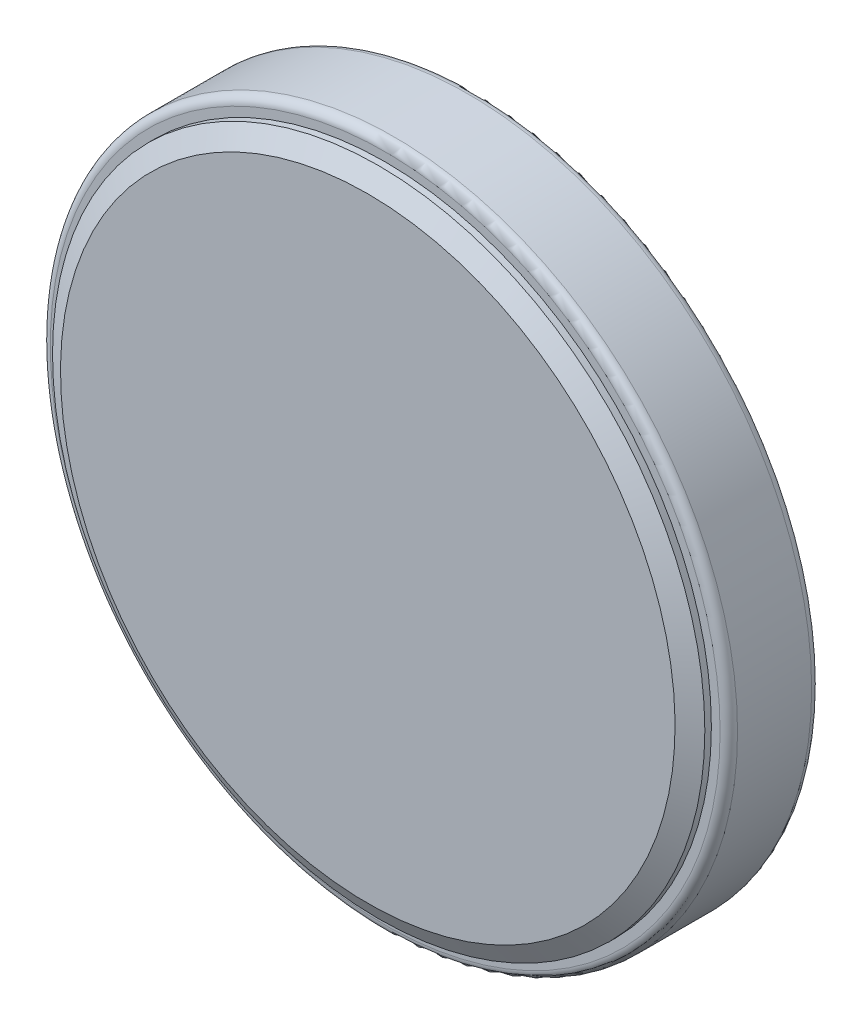
ISO-10303-21;
HEADER;
FILE_DESCRIPTION(('STEP AP214'),'2;1');
FILE_NAME('part.step','',(''),(''),'','','');
FILE_SCHEMA(('AUTOMOTIVE_DESIGN { 1 0 10303 214 1 1 1 1 }'));
ENDSEC;
DATA;
#1=APPLICATION_CONTEXT('core data for automotive mechanical design processes');
#2=APPLICATION_PROTOCOL_DEFINITION('international standard','automotive_design',2000,#1);
#3=PRODUCT_CONTEXT('',#1,'mechanical');
#4=PRODUCT('Part','Part','',(#3));
#5=PRODUCT_RELATED_PRODUCT_CATEGORY('part','',(#4));
#6=PRODUCT_DEFINITION_FORMATION('','',#4);
#7=PRODUCT_DEFINITION_CONTEXT('part definition',#1,'design');
#8=PRODUCT_DEFINITION('design','',#6,#7);
#9=PRODUCT_DEFINITION_SHAPE('','',#8);
#10=(LENGTH_UNIT() NAMED_UNIT(*) SI_UNIT(.MILLI.,.METRE.));
#11=(NAMED_UNIT(*) PLANE_ANGLE_UNIT() SI_UNIT($,.RADIAN.));
#12=(NAMED_UNIT(*) SI_UNIT($,.STERADIAN.) SOLID_ANGLE_UNIT());
#13=UNCERTAINTY_MEASURE_WITH_UNIT(LENGTH_MEASURE(1.E-05),#10,'distance_accuracy_value','');
#14=(GEOMETRIC_REPRESENTATION_CONTEXT(3) GLOBAL_UNCERTAINTY_ASSIGNED_CONTEXT((#13)) GLOBAL_UNIT_ASSIGNED_CONTEXT((#10,
#11,#12)) REPRESENTATION_CONTEXT('',''));
#15=CARTESIAN_POINT('',(0.,0.,0.));
#16=DIRECTION('',(0.,0.,1.));
#17=DIRECTION('',(1.,0.,0.));
#18=AXIS2_PLACEMENT_3D('',#15,#16,#17);
#19=CARTESIAN_POINT('',(0.,0.,0.508));
#20=DIRECTION('',(0.,0.,1.));
#21=DIRECTION('',(1.,0.,0.));
#22=AXIS2_PLACEMENT_3D('',#19,#20,#21);
#23=PLANE('',#22);
#24=CARTESIAN_POINT('',(0.,0.,0.508000019684426));
#25=DIRECTION('',(0.,0.,-1.));
#26=DIRECTION('',(0.,1.,0.));
#27=AXIS2_PLACEMENT_3D('',#24,#25,#26);
#28=CIRCLE('',#27,8.94967387996169);
#29=CARTESIAN_POINT('',(0.,8.94967387996169,0.508000019684426));
#30=VERTEX_POINT('',#29);
#31=EDGE_CURVE('E19',#30,#30,#28,.T.);
#32=ORIENTED_EDGE('',*,*,#31,.F.);
#33=EDGE_LOOP('',(#32));
#34=FACE_BOUND('',#33,.T.);
#35=ADVANCED_FACE('F16',(#34),#23,.T.);
#36=CARTESIAN_POINT('',(0.,0.,0.190500019026384));
#37=DIRECTION('',(0.,0.,-1.));
#38=DIRECTION('',(0.,1.,0.));
#39=AXIS2_PLACEMENT_3D('',#36,#37,#38);
#40=CONICAL_SURFACE('',#39,9.49960001098489,1.04719755);
#41=ORIENTED_EDGE('',*,*,#31,.T.);
#42=EDGE_LOOP('',(#41));
#43=FACE_BOUND('',#42,.T.);
#44=CARTESIAN_POINT('',(0.,0.,0.190500000000003));
#45=DIRECTION('',(0.,0.,-1.));
#46=DIRECTION('',(-1.,0.,0.));
#47=AXIS2_PLACEMENT_3D('',#44,#45,#46);
#48=CIRCLE('',#47,9.4996);
#49=CARTESIAN_POINT('',(-9.4996,0.,0.190500000000003));
#50=VERTEX_POINT('',#49);
#51=EDGE_CURVE('E177',#50,#50,#48,.T.);
#52=ORIENTED_EDGE('',*,*,#51,.F.);
#53=EDGE_LOOP('',(#52));
#54=FACE_BOUND('',#53,.T.);
#55=ADVANCED_FACE('F198',(#43,#54),#40,.T.);
#56=CARTESIAN_POINT('',(0.,0.,32.7109263142389));
#57=DIRECTION('',(0.,0.,-1.));
#58=DIRECTION('',(-1.,0.,0.));
#59=AXIS2_PLACEMENT_3D('',#56,#57,#58);
#60=CYLINDRICAL_SURFACE('',#59,9.4996);
#61=ORIENTED_EDGE('',*,*,#51,.T.);
#62=EDGE_LOOP('',(#61));
#63=FACE_BOUND('',#62,.T.);
#64=CARTESIAN_POINT('',(0.,0.,0.));
#65=DIRECTION('',(0.,0.,-1.));
#66=DIRECTION('',(-1.,0.,0.));
#67=AXIS2_PLACEMENT_3D('',#64,#65,#66);
#68=CIRCLE('',#67,9.4996);
#69=CARTESIAN_POINT('',(-9.4996,0.,0.));
#70=VERTEX_POINT('',#69);
#71=EDGE_CURVE('E185',#70,#70,#68,.T.);
#72=ORIENTED_EDGE('',*,*,#71,.F.);
#73=EDGE_LOOP('',(#72));
#74=FACE_BOUND('',#73,.T.);
#75=ADVANCED_FACE('F193',(#63,#74),#60,.T.);
#76=CARTESIAN_POINT('',(0.,0.,0.));
#77=DIRECTION('',(0.,0.,1.));
#78=DIRECTION('',(1.,0.,0.));
#79=AXIS2_PLACEMENT_3D('',#76,#77,#78);
#80=PLANE('',#79);
#81=ORIENTED_EDGE('',*,*,#71,.T.);
#82=EDGE_LOOP('',(#81));
#83=FACE_BOUND('',#82,.T.);
#84=CARTESIAN_POINT('',(0.,0.,0.));
#85=DIRECTION('',(0.,0.,-1.));
#86=DIRECTION('',(1.,0.,0.));
#87=AXIS2_PLACEMENT_3D('',#84,#85,#86);
#88=CIRCLE('',#87,9.7536);
#89=CARTESIAN_POINT('',(9.7536,0.,0.));
#90=VERTEX_POINT('',#89);
#91=EDGE_CURVE('E154',#90,#90,#88,.T.);
#92=ORIENTED_EDGE('',*,*,#91,.F.);
#93=EDGE_LOOP('',(#92));
#94=FACE_BOUND('',#93,.T.);
#95=ADVANCED_FACE('F167',(#83,#94),#80,.T.);
#96=CARTESIAN_POINT('',(0.,0.,-0.254));
#97=DIRECTION('',(0.,0.,1.));
#98=DIRECTION('',(1.,0.,0.));
#99=AXIS2_PLACEMENT_3D('',#96,#97,#98);
#100=TOROIDAL_SURFACE('',#99,9.7536,0.254);
#101=CARTESIAN_POINT('',(0.,0.,-0.254));
#102=DIRECTION('',(0.,0.,1.));
#103=DIRECTION('',(1.,0.,0.));
#104=AXIS2_PLACEMENT_3D('',#101,#102,#103);
#105=CIRCLE('',#104,10.0076);
#106=CARTESIAN_POINT('',(10.0076,0.,-0.254));
#107=VERTEX_POINT('',#106);
#108=EDGE_CURVE('E146',#107,#107,#105,.F.);
#109=ORIENTED_EDGE('',*,*,#108,.F.);
#110=EDGE_LOOP('',(#109));
#111=FACE_BOUND('',#110,.T.);
#112=ORIENTED_EDGE('',*,*,#91,.T.);
#113=EDGE_LOOP('',(#112));
#114=FACE_BOUND('',#113,.T.);
#115=ADVANCED_FACE('F162',(#111,#114),#100,.T.);
#116=CARTESIAN_POINT('',(0.,0.,-2.667));
#117=DIRECTION('',(0.,0.,1.));
#118=DIRECTION('',(1.,0.,0.));
#119=AXIS2_PLACEMENT_3D('',#116,#117,#118);
#120=CYLINDRICAL_SURFACE('',#119,10.0076);
#121=CARTESIAN_POINT('',(0.,0.,-2.413));
#122=DIRECTION('',(0.,0.,1.));
#123=DIRECTION('',(1.,0.,0.));
#124=AXIS2_PLACEMENT_3D('',#121,#122,#123);
#125=CIRCLE('',#124,10.0076);
#126=CARTESIAN_POINT('',(10.0076,0.,-2.413));
#127=VERTEX_POINT('',#126);
#128=EDGE_CURVE('E113',#127,#127,#125,.F.);
#129=ORIENTED_EDGE('',*,*,#128,.F.);
#130=EDGE_LOOP('',(#129));
#131=FACE_BOUND('',#130,.T.);
#132=ORIENTED_EDGE('',*,*,#108,.T.);
#133=EDGE_LOOP('',(#132));
#134=FACE_BOUND('',#133,.T.);
#135=ADVANCED_FACE('F166',(#131,#134),#120,.T.);
#136=CARTESIAN_POINT('',(0.254,-2.54,-2.413));
#137=DIRECTION('',(0.,0.,-1.));
#138=DIRECTION('',(-1.,0.,0.));
#139=AXIS2_PLACEMENT_3D('',#136,#137,#138);
#140=PLANE('',#139);
#141=DIRECTION('',(0.,1.,0.));
#142=VECTOR('',#141,1.);
#143=CARTESIAN_POINT('',(-0.254,2.54,-2.413));
#144=LINE('',#143,#142);
#145=CARTESIAN_POINT('',(-0.254,0.254,-2.413));
#146=VERTEX_POINT('',#145);
#147=CARTESIAN_POINT('',(-0.254,2.54,-2.413));
#148=VERTEX_POINT('',#147);
#149=EDGE_CURVE('E269',#146,#148,#144,.T.);
#150=ORIENTED_EDGE('',*,*,#149,.T.);
#151=DIRECTION('',(1.,0.,0.));
#152=VECTOR('',#151,1.);
#153=CARTESIAN_POINT('',(0.254,2.54,-2.413));
#154=LINE('',#153,#152);
#155=CARTESIAN_POINT('',(0.254,2.54,-2.413));
#156=VERTEX_POINT('',#155);
#157=EDGE_CURVE('E264',#148,#156,#154,.T.);
#158=ORIENTED_EDGE('',*,*,#157,.T.);
#159=DIRECTION('',(0.,1.,0.));
#160=VECTOR('',#159,1.);
#161=CARTESIAN_POINT('',(0.254,2.54,-2.413));
#162=LINE('',#161,#160);
#163=CARTESIAN_POINT('',(0.254,0.254,-2.413));
#164=VERTEX_POINT('',#163);
#165=EDGE_CURVE('E259',#156,#164,#162,.F.);
#166=ORIENTED_EDGE('',*,*,#165,.T.);
#167=DIRECTION('',(1.,0.,0.));
#168=VECTOR('',#167,1.);
#169=CARTESIAN_POINT('',(0.254,0.254,-2.413));
#170=LINE('',#169,#168);
#171=CARTESIAN_POINT('',(2.54,0.254,-2.413));
#172=VERTEX_POINT('',#171);
#173=EDGE_CURVE('E107',#164,#172,#170,.T.);
#174=ORIENTED_EDGE('',*,*,#173,.T.);
#175=DIRECTION('',(0.,1.,0.));
#176=VECTOR('',#175,1.);
#177=CARTESIAN_POINT('',(2.54,0.254,-2.413));
#178=LINE('',#177,#176);
#179=CARTESIAN_POINT('',(2.54,-0.254,-2.413));
#180=VERTEX_POINT('',#179);
#181=EDGE_CURVE('E105',#172,#180,#178,.F.);
#182=ORIENTED_EDGE('',*,*,#181,.T.);
#183=DIRECTION('',(1.,0.,0.));
#184=VECTOR('',#183,1.);
#185=CARTESIAN_POINT('',(0.254,-0.254,-2.413));
#186=LINE('',#185,#184);
#187=CARTESIAN_POINT('',(0.254,-0.254,-2.413));
#188=VERTEX_POINT('',#187);
#189=EDGE_CURVE('E102',#180,#188,#186,.F.);
#190=ORIENTED_EDGE('',*,*,#189,.T.);
#191=DIRECTION('',(0.,1.,0.));
#192=VECTOR('',#191,1.);
#193=CARTESIAN_POINT('',(0.254,-0.254,-2.413));
#194=LINE('',#193,#192);
#195=CARTESIAN_POINT('',(0.254,-2.54,-2.413));
#196=VERTEX_POINT('',#195);
#197=EDGE_CURVE('E299',#188,#196,#194,.F.);
#198=ORIENTED_EDGE('',*,*,#197,.T.);
#199=DIRECTION('',(1.,0.,0.));
#200=VECTOR('',#199,1.);
#201=CARTESIAN_POINT('',(0.254,-2.54,-2.413));
#202=LINE('',#201,#200);
#203=CARTESIAN_POINT('',(-0.254,-2.54,-2.413));
#204=VERTEX_POINT('',#203);
#205=EDGE_CURVE('E294',#196,#204,#202,.F.);
#206=ORIENTED_EDGE('',*,*,#205,.T.);
#207=DIRECTION('',(0.,1.,0.));
#208=VECTOR('',#207,1.);
#209=CARTESIAN_POINT('',(-0.254,-0.254,-2.413));
#210=LINE('',#209,#208);
#211=CARTESIAN_POINT('',(-0.254,-0.254,-2.413));
#212=VERTEX_POINT('',#211);
#213=EDGE_CURVE('E289',#204,#212,#210,.T.);
#214=ORIENTED_EDGE('',*,*,#213,.T.);
#215=DIRECTION('',(1.,0.,0.));
#216=VECTOR('',#215,1.);
#217=CARTESIAN_POINT('',(-0.254,-0.254,-2.413));
#218=LINE('',#217,#216);
#219=CARTESIAN_POINT('',(-2.54,-0.254,-2.413));
#220=VERTEX_POINT('',#219);
#221=EDGE_CURVE('E284',#212,#220,#218,.F.);
#222=ORIENTED_EDGE('',*,*,#221,.T.);
#223=DIRECTION('',(0.,1.,0.));
#224=VECTOR('',#223,1.);
#225=CARTESIAN_POINT('',(-2.54,0.254,-2.413));
#226=LINE('',#225,#224);
#227=CARTESIAN_POINT('',(-2.54,0.254,-2.413));
#228=VERTEX_POINT('',#227);
#229=EDGE_CURVE('E279',#220,#228,#226,.T.);
#230=ORIENTED_EDGE('',*,*,#229,.T.);
#231=DIRECTION('',(1.,0.,0.));
#232=VECTOR('',#231,1.);
#233=CARTESIAN_POINT('',(-0.254,0.254,-2.413));
#234=LINE('',#233,#232);
#235=EDGE_CURVE('E274',#228,#146,#234,.T.);
#236=ORIENTED_EDGE('',*,*,#235,.T.);
#237=EDGE_LOOP('',(#150,#158,#166,#174,#182,#190,#198,#206,#214,#222,#230,#236));
#238=FACE_BOUND('',#237,.T.);
#239=ADVANCED_FACE('F106',(#238),#140,.T.);
#240=CARTESIAN_POINT('',(0.,0.,-2.413));
#241=DIRECTION('',(0.,0.,1.));
#242=DIRECTION('',(1.,0.,0.));
#243=AXIS2_PLACEMENT_3D('',#240,#241,#242);
#244=TOROIDAL_SURFACE('',#243,9.7536,0.254);
#245=CARTESIAN_POINT('',(0.,0.,-2.667));
#246=DIRECTION('',(0.,0.,1.));
#247=DIRECTION('',(1.,0.,0.));
#248=AXIS2_PLACEMENT_3D('',#245,#246,#247);
#249=CIRCLE('',#248,9.7536);
#250=CARTESIAN_POINT('',(9.7536,0.,-2.667));
#251=VERTEX_POINT('',#250);
#252=EDGE_CURVE('E254',#251,#251,#249,.T.);
#253=ORIENTED_EDGE('',*,*,#252,.T.);
#254=EDGE_LOOP('',(#253));
#255=FACE_BOUND('',#254,.T.);
#256=ORIENTED_EDGE('',*,*,#128,.T.);
#257=EDGE_LOOP('',(#256));
#258=FACE_BOUND('',#257,.T.);
#259=ADVANCED_FACE('F132',(#255,#258),#244,.T.);
#260=CARTESIAN_POINT('',(2.54,0.254,-2.413));
#261=DIRECTION('',(1.,0.,0.));
#262=DIRECTION('',(0.,0.,-1.));
#263=AXIS2_PLACEMENT_3D('',#260,#261,#262);
#264=PLANE('',#263);
#265=DIRECTION('',(0.,0.,-1.));
#266=VECTOR('',#265,1.);
#267=CARTESIAN_POINT('',(2.54,-0.254,-2.413));
#268=LINE('',#267,#266);
#269=CARTESIAN_POINT('',(2.54,-0.254,-2.667));
#270=VERTEX_POINT('',#269);
#271=EDGE_CURVE('E112',#270,#180,#268,.F.);
#272=ORIENTED_EDGE('',*,*,#271,.T.);
#273=ORIENTED_EDGE('',*,*,#181,.F.);
#274=DIRECTION('',(0.,0.,1.));
#275=VECTOR('',#274,1.);
#276=CARTESIAN_POINT('',(2.54,0.254,-2.413));
#277=LINE('',#276,#275);
#278=CARTESIAN_POINT('',(2.54,0.254,-2.667));
#279=VERTEX_POINT('',#278);
#280=EDGE_CURVE('E255',#172,#279,#277,.F.);
#281=ORIENTED_EDGE('',*,*,#280,.T.);
#282=DIRECTION('',(0.,1.,0.));
#283=VECTOR('',#282,1.);
#284=CARTESIAN_POINT('',(2.54,0.,-2.667));
#285=LINE('',#284,#283);
#286=EDGE_CURVE('E124',#279,#270,#285,.F.);
#287=ORIENTED_EDGE('',*,*,#286,.T.);
#288=EDGE_LOOP('',(#272,#273,#281,#287));
#289=FACE_BOUND('',#288,.T.);
#290=ADVANCED_FACE('F123',(#289),#264,.F.);
#291=CARTESIAN_POINT('',(0.254,-0.254,-2.413));
#292=DIRECTION('',(0.,-1.,0.));
#293=DIRECTION('',(0.,0.,-1.));
#294=AXIS2_PLACEMENT_3D('',#291,#292,#293);
#295=PLANE('',#294);
#296=DIRECTION('',(0.,0.,-1.));
#297=VECTOR('',#296,1.);
#298=CARTESIAN_POINT('',(0.254,-0.254,-2.413));
#299=LINE('',#298,#297);
#300=CARTESIAN_POINT('',(0.254,-0.254,-2.667));
#301=VERTEX_POINT('',#300);
#302=EDGE_CURVE('E120',#301,#188,#299,.F.);
#303=ORIENTED_EDGE('',*,*,#302,.T.);
#304=ORIENTED_EDGE('',*,*,#189,.F.);
#305=ORIENTED_EDGE('',*,*,#271,.F.);
#306=DIRECTION('',(1.,0.,0.));
#307=VECTOR('',#306,1.);
#308=CARTESIAN_POINT('',(0.,-0.254,-2.667));
#309=LINE('',#308,#307);
#310=EDGE_CURVE('E251',#270,#301,#309,.F.);
#311=ORIENTED_EDGE('',*,*,#310,.T.);
#312=EDGE_LOOP('',(#303,#304,#305,#311));
#313=FACE_BOUND('',#312,.T.);
#314=ADVANCED_FACE('F117',(#313),#295,.F.);
#315=CARTESIAN_POINT('',(0.254,-0.254,-2.413));
#316=DIRECTION('',(1.,0.,0.));
#317=DIRECTION('',(0.,0.,-1.));
#318=AXIS2_PLACEMENT_3D('',#315,#316,#317);
#319=PLANE('',#318);
#320=DIRECTION('',(0.,0.,-1.));
#321=VECTOR('',#320,1.);
#322=CARTESIAN_POINT('',(0.254,-2.54,-2.413));
#323=LINE('',#322,#321);
#324=CARTESIAN_POINT('',(0.254,-2.54,-2.667));
#325=VERTEX_POINT('',#324);
#326=EDGE_CURVE('E296',#325,#196,#323,.F.);
#327=ORIENTED_EDGE('',*,*,#326,.T.);
#328=ORIENTED_EDGE('',*,*,#197,.F.);
#329=ORIENTED_EDGE('',*,*,#302,.F.);
#330=DIRECTION('',(0.,1.,0.));
#331=VECTOR('',#330,1.);
#332=CARTESIAN_POINT('',(0.254,0.,-2.667));
#333=LINE('',#332,#331);
#334=EDGE_CURVE('E248',#301,#325,#333,.F.);
#335=ORIENTED_EDGE('',*,*,#334,.T.);
#336=EDGE_LOOP('',(#327,#328,#329,#335));
#337=FACE_BOUND('',#336,.T.);
#338=ADVANCED_FACE('F306',(#337),#319,.F.);
#339=CARTESIAN_POINT('',(0.254,-2.54,-2.413));
#340=DIRECTION('',(0.,-1.,0.));
#341=DIRECTION('',(0.,0.,-1.));
#342=AXIS2_PLACEMENT_3D('',#339,#340,#341);
#343=PLANE('',#342);
#344=DIRECTION('',(0.,0.,1.));
#345=VECTOR('',#344,1.);
#346=CARTESIAN_POINT('',(-0.254,-2.54,-2.413));
#347=LINE('',#346,#345);
#348=CARTESIAN_POINT('',(-0.254,-2.54,-2.667));
#349=VERTEX_POINT('',#348);
#350=EDGE_CURVE('E291',#349,#204,#347,.T.);
#351=ORIENTED_EDGE('',*,*,#350,.T.);
#352=ORIENTED_EDGE('',*,*,#205,.F.);
#353=ORIENTED_EDGE('',*,*,#326,.F.);
#354=DIRECTION('',(1.,0.,0.));
#355=VECTOR('',#354,1.);
#356=CARTESIAN_POINT('',(0.,-2.54,-2.667));
#357=LINE('',#356,#355);
#358=EDGE_CURVE('E245',#325,#349,#357,.F.);
#359=ORIENTED_EDGE('',*,*,#358,.T.);
#360=EDGE_LOOP('',(#351,#352,#353,#359));
#361=FACE_BOUND('',#360,.T.);
#362=ADVANCED_FACE('F304',(#361),#343,.F.);
#363=CARTESIAN_POINT('',(-0.254,-0.254,-2.413));
#364=DIRECTION('',(-1.,0.,0.));
#365=DIRECTION('',(0.,0.,1.));
#366=AXIS2_PLACEMENT_3D('',#363,#364,#365);
#367=PLANE('',#366);
#368=DIRECTION('',(0.,0.,-1.));
#369=VECTOR('',#368,1.);
#370=CARTESIAN_POINT('',(-0.254,-0.254,-2.413));
#371=LINE('',#370,#369);
#372=CARTESIAN_POINT('',(-0.254,-0.254,-2.667));
#373=VERTEX_POINT('',#372);
#374=EDGE_CURVE('E286',#373,#212,#371,.F.);
#375=ORIENTED_EDGE('',*,*,#374,.T.);
#376=ORIENTED_EDGE('',*,*,#213,.F.);
#377=ORIENTED_EDGE('',*,*,#350,.F.);
#378=DIRECTION('',(0.,1.,0.));
#379=VECTOR('',#378,1.);
#380=CARTESIAN_POINT('',(-0.254,0.,-2.667));
#381=LINE('',#380,#379);
#382=EDGE_CURVE('E242',#349,#373,#381,.T.);
#383=ORIENTED_EDGE('',*,*,#382,.T.);
#384=EDGE_LOOP('',(#375,#376,#377,#383));
#385=FACE_BOUND('',#384,.T.);
#386=ADVANCED_FACE('F312',(#385),#367,.F.);
#387=CARTESIAN_POINT('',(-0.254,-0.254,-2.413));
#388=DIRECTION('',(0.,-1.,0.));
#389=DIRECTION('',(0.,0.,-1.));
#390=AXIS2_PLACEMENT_3D('',#387,#388,#389);
#391=PLANE('',#390);
#392=DIRECTION('',(0.,0.,1.));
#393=VECTOR('',#392,1.);
#394=CARTESIAN_POINT('',(-2.54,-0.254,-2.413));
#395=LINE('',#394,#393);
#396=CARTESIAN_POINT('',(-2.54,-0.254,-2.667));
#397=VERTEX_POINT('',#396);
#398=EDGE_CURVE('E281',#397,#220,#395,.T.);
#399=ORIENTED_EDGE('',*,*,#398,.T.);
#400=ORIENTED_EDGE('',*,*,#221,.F.);
#401=ORIENTED_EDGE('',*,*,#374,.F.);
#402=DIRECTION('',(1.,0.,0.));
#403=VECTOR('',#402,1.);
#404=CARTESIAN_POINT('',(0.,-0.254,-2.667));
#405=LINE('',#404,#403);
#406=EDGE_CURVE('E239',#373,#397,#405,.F.);
#407=ORIENTED_EDGE('',*,*,#406,.T.);
#408=EDGE_LOOP('',(#399,#400,#401,#407));
#409=FACE_BOUND('',#408,.T.);
#410=ADVANCED_FACE('F316',(#409),#391,.F.);
#411=CARTESIAN_POINT('',(-2.54,0.254,-2.413));
#412=DIRECTION('',(-1.,0.,0.));
#413=DIRECTION('',(0.,0.,1.));
#414=AXIS2_PLACEMENT_3D('',#411,#412,#413);
#415=PLANE('',#414);
#416=DIRECTION('',(0.,0.,1.));
#417=VECTOR('',#416,1.);
#418=CARTESIAN_POINT('',(-2.54,0.254,-2.413));
#419=LINE('',#418,#417);
#420=CARTESIAN_POINT('',(-2.54,0.254,-2.667));
#421=VERTEX_POINT('',#420);
#422=EDGE_CURVE('E276',#421,#228,#419,.T.);
#423=ORIENTED_EDGE('',*,*,#422,.T.);
#424=ORIENTED_EDGE('',*,*,#229,.F.);
#425=ORIENTED_EDGE('',*,*,#398,.F.);
#426=DIRECTION('',(0.,1.,0.));
#427=VECTOR('',#426,1.);
#428=CARTESIAN_POINT('',(-2.54,0.,-2.667));
#429=LINE('',#428,#427);
#430=EDGE_CURVE('E236',#397,#421,#429,.T.);
#431=ORIENTED_EDGE('',*,*,#430,.T.);
#432=EDGE_LOOP('',(#423,#424,#425,#431));
#433=FACE_BOUND('',#432,.T.);
#434=ADVANCED_FACE('F318',(#433),#415,.F.);
#435=CARTESIAN_POINT('',(-0.254,0.254,-2.413));
#436=DIRECTION('',(0.,1.,0.));
#437=DIRECTION('',(0.,0.,1.));
#438=AXIS2_PLACEMENT_3D('',#435,#436,#437);
#439=PLANE('',#438);
#440=DIRECTION('',(0.,0.,1.));
#441=VECTOR('',#440,1.);
#442=CARTESIAN_POINT('',(-0.254,0.254,-2.413));
#443=LINE('',#442,#441);
#444=CARTESIAN_POINT('',(-0.254,0.254,-2.667));
#445=VERTEX_POINT('',#444);
#446=EDGE_CURVE('E271',#445,#146,#443,.T.);
#447=ORIENTED_EDGE('',*,*,#446,.T.);
#448=ORIENTED_EDGE('',*,*,#235,.F.);
#449=ORIENTED_EDGE('',*,*,#422,.F.);
#450=DIRECTION('',(1.,0.,0.));
#451=VECTOR('',#450,1.);
#452=CARTESIAN_POINT('',(0.,0.254,-2.667));
#453=LINE('',#452,#451);
#454=EDGE_CURVE('E233',#421,#445,#453,.T.);
#455=ORIENTED_EDGE('',*,*,#454,.T.);
#456=EDGE_LOOP('',(#447,#448,#449,#455));
#457=FACE_BOUND('',#456,.T.);
#458=ADVANCED_FACE('F323',(#457),#439,.F.);
#459=CARTESIAN_POINT('',(-0.254,2.54,-2.413));
#460=DIRECTION('',(-1.,0.,0.));
#461=DIRECTION('',(0.,0.,1.));
#462=AXIS2_PLACEMENT_3D('',#459,#460,#461);
#463=PLANE('',#462);
#464=DIRECTION('',(0.,0.,1.));
#465=VECTOR('',#464,1.);
#466=CARTESIAN_POINT('',(-0.254,2.54,-2.413));
#467=LINE('',#466,#465);
#468=CARTESIAN_POINT('',(-0.254,2.54,-2.667));
#469=VERTEX_POINT('',#468);
#470=EDGE_CURVE('E266',#469,#148,#467,.T.);
#471=ORIENTED_EDGE('',*,*,#470,.T.);
#472=ORIENTED_EDGE('',*,*,#149,.F.);
#473=ORIENTED_EDGE('',*,*,#446,.F.);
#474=DIRECTION('',(0.,1.,0.));
#475=VECTOR('',#474,1.);
#476=CARTESIAN_POINT('',(-0.254,0.,-2.667));
#477=LINE('',#476,#475);
#478=EDGE_CURVE('E230',#445,#469,#477,.T.);
#479=ORIENTED_EDGE('',*,*,#478,.T.);
#480=EDGE_LOOP('',(#471,#472,#473,#479));
#481=FACE_BOUND('',#480,.T.);
#482=ADVANCED_FACE('F328',(#481),#463,.F.);
#483=CARTESIAN_POINT('',(0.254,2.54,-2.413));
#484=DIRECTION('',(0.,1.,0.));
#485=DIRECTION('',(0.,0.,1.));
#486=AXIS2_PLACEMENT_3D('',#483,#484,#485);
#487=PLANE('',#486);
#488=DIRECTION('',(0.,0.,-1.));
#489=VECTOR('',#488,1.);
#490=CARTESIAN_POINT('',(0.254,2.54,-2.413));
#491=LINE('',#490,#489);
#492=CARTESIAN_POINT('',(0.254,2.54,-2.667));
#493=VERTEX_POINT('',#492);
#494=EDGE_CURVE('E261',#493,#156,#491,.F.);
#495=ORIENTED_EDGE('',*,*,#494,.T.);
#496=ORIENTED_EDGE('',*,*,#157,.F.);
#497=ORIENTED_EDGE('',*,*,#470,.F.);
#498=DIRECTION('',(1.,0.,0.));
#499=VECTOR('',#498,1.);
#500=CARTESIAN_POINT('',(0.,2.54,-2.667));
#501=LINE('',#500,#499);
#502=EDGE_CURVE('E227',#469,#493,#501,.T.);
#503=ORIENTED_EDGE('',*,*,#502,.T.);
#504=EDGE_LOOP('',(#495,#496,#497,#503));
#505=FACE_BOUND('',#504,.T.);
#506=ADVANCED_FACE('F330',(#505),#487,.F.);
#507=CARTESIAN_POINT('',(0.254,2.54,-2.413));
#508=DIRECTION('',(1.,0.,0.));
#509=DIRECTION('',(0.,0.,-1.));
#510=AXIS2_PLACEMENT_3D('',#507,#508,#509);
#511=PLANE('',#510);
#512=DIRECTION('',(0.,0.,1.));
#513=VECTOR('',#512,1.);
#514=CARTESIAN_POINT('',(0.254,0.254,-2.413));
#515=LINE('',#514,#513);
#516=CARTESIAN_POINT('',(0.254,0.254,-2.667));
#517=VERTEX_POINT('',#516);
#518=EDGE_CURVE('E33',#517,#164,#515,.T.);
#519=ORIENTED_EDGE('',*,*,#518,.T.);
#520=ORIENTED_EDGE('',*,*,#165,.F.);
#521=ORIENTED_EDGE('',*,*,#494,.F.);
#522=DIRECTION('',(0.,1.,0.));
#523=VECTOR('',#522,1.);
#524=CARTESIAN_POINT('',(0.254,0.,-2.667));
#525=LINE('',#524,#523);
#526=EDGE_CURVE('E25',#493,#517,#525,.F.);
#527=ORIENTED_EDGE('',*,*,#526,.T.);
#528=EDGE_LOOP('',(#519,#520,#521,#527));
#529=FACE_BOUND('',#528,.T.);
#530=ADVANCED_FACE('F208',(#529),#511,.F.);
#531=CARTESIAN_POINT('',(0.254,0.254,-2.413));
#532=DIRECTION('',(0.,1.,0.));
#533=DIRECTION('',(0.,0.,1.));
#534=AXIS2_PLACEMENT_3D('',#531,#532,#533);
#535=PLANE('',#534);
#536=ORIENTED_EDGE('',*,*,#280,.F.);
#537=ORIENTED_EDGE('',*,*,#173,.F.);
#538=ORIENTED_EDGE('',*,*,#518,.F.);
#539=DIRECTION('',(1.,0.,0.));
#540=VECTOR('',#539,1.);
#541=CARTESIAN_POINT('',(0.,0.254,-2.667));
#542=LINE('',#541,#540);
#543=EDGE_CURVE('E10',#517,#279,#542,.T.);
#544=ORIENTED_EDGE('',*,*,#543,.T.);
#545=EDGE_LOOP('',(#536,#537,#538,#544));
#546=FACE_BOUND('',#545,.T.);
#547=ADVANCED_FACE('F202',(#546),#535,.F.);
#548=CARTESIAN_POINT('',(0.,0.,-2.667));
#549=DIRECTION('',(0.,0.,1.));
#550=DIRECTION('',(1.,0.,0.));
#551=AXIS2_PLACEMENT_3D('',#548,#549,#550);
#552=PLANE('',#551);
#553=ORIENTED_EDGE('',*,*,#526,.F.);
#554=ORIENTED_EDGE('',*,*,#502,.F.);
#555=ORIENTED_EDGE('',*,*,#478,.F.);
#556=ORIENTED_EDGE('',*,*,#454,.F.);
#557=ORIENTED_EDGE('',*,*,#430,.F.);
#558=ORIENTED_EDGE('',*,*,#406,.F.);
#559=ORIENTED_EDGE('',*,*,#382,.F.);
#560=ORIENTED_EDGE('',*,*,#358,.F.);
#561=ORIENTED_EDGE('',*,*,#334,.F.);
#562=ORIENTED_EDGE('',*,*,#310,.F.);
#563=ORIENTED_EDGE('',*,*,#286,.F.);
#564=ORIENTED_EDGE('',*,*,#543,.F.);
#565=EDGE_LOOP('',(#553,#554,#555,#556,#557,#558,#559,#560,#561,#562,#563,#564));
#566=FACE_BOUND('',#565,.T.);
#567=ORIENTED_EDGE('',*,*,#252,.F.);
#568=EDGE_LOOP('',(#567));
#569=FACE_BOUND('',#568,.T.);
#570=ADVANCED_FACE('F200',(#566,#569),#552,.F.);
#571=CLOSED_SHELL('',(#35,#55,#75,#95,#115,#135,#239,#259,#290,#314,#338,#362,#386,#410,#434,
#458,#482,#506,#530,#547,#570));
#572=MANIFOLD_SOLID_BREP('B1',#571);
#573=ADVANCED_BREP_SHAPE_REPRESENTATION('',(#18,#572),#14);
#574=SHAPE_DEFINITION_REPRESENTATION(#9,#573);
ENDSEC;
END-ISO-10303-21;
